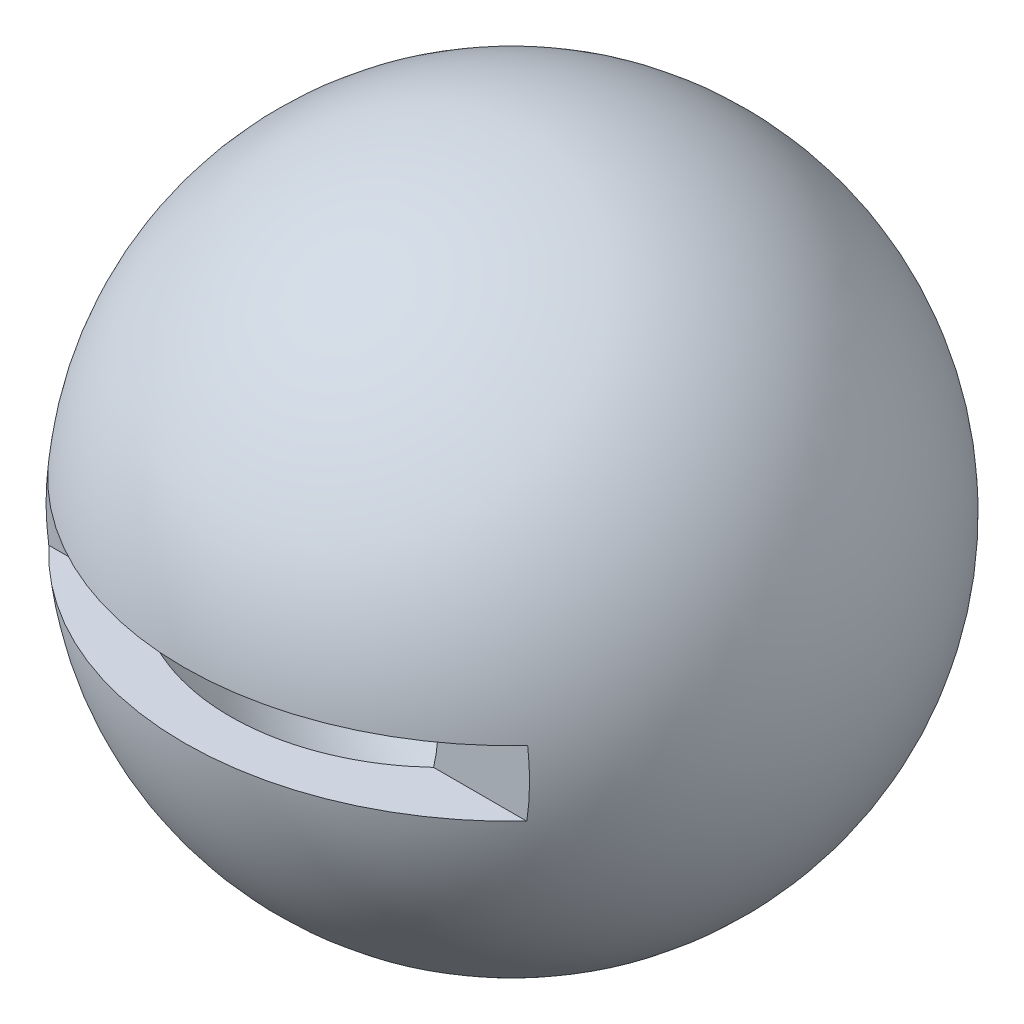
ISO-10303-21;
HEADER;
FILE_DESCRIPTION(('STEP AP214'),'2;1');
FILE_NAME('part.step','',(''),(''),'','','');
FILE_SCHEMA(('AUTOMOTIVE_DESIGN { 1 0 10303 214 1 1 1 1 }'));
ENDSEC;
DATA;
#1=APPLICATION_CONTEXT('core data for automotive mechanical design processes');
#2=APPLICATION_PROTOCOL_DEFINITION('international standard','automotive_design',2000,#1);
#3=PRODUCT_CONTEXT('',#1,'mechanical');
#4=PRODUCT('Part','Part','',(#3));
#5=PRODUCT_RELATED_PRODUCT_CATEGORY('part','',(#4));
#6=PRODUCT_DEFINITION_FORMATION('','',#4);
#7=PRODUCT_DEFINITION_CONTEXT('part definition',#1,'design');
#8=PRODUCT_DEFINITION('design','',#6,#7);
#9=PRODUCT_DEFINITION_SHAPE('','',#8);
#10=(LENGTH_UNIT() NAMED_UNIT(*) SI_UNIT(.MILLI.,.METRE.));
#11=(NAMED_UNIT(*) PLANE_ANGLE_UNIT() SI_UNIT($,.RADIAN.));
#12=(NAMED_UNIT(*) SI_UNIT($,.STERADIAN.) SOLID_ANGLE_UNIT());
#13=UNCERTAINTY_MEASURE_WITH_UNIT(LENGTH_MEASURE(1.E-05),#10,'distance_accuracy_value','');
#14=(GEOMETRIC_REPRESENTATION_CONTEXT(3) GLOBAL_UNCERTAINTY_ASSIGNED_CONTEXT((#13)) GLOBAL_UNIT_ASSIGNED_CONTEXT((#10,
#11,#12)) REPRESENTATION_CONTEXT('',''));
#15=CARTESIAN_POINT('',(0.,0.,0.));
#16=DIRECTION('',(0.,0.,1.));
#17=DIRECTION('',(1.,0.,0.));
#18=AXIS2_PLACEMENT_3D('',#15,#16,#17);
#19=CARTESIAN_POINT('',(0.,-25.,5.17896436009276));
#20=DIRECTION('',(0.,0.,-1.));
#21=DIRECTION('',(-1.,0.,0.));
#22=AXIS2_PLACEMENT_3D('',#19,#20,#21);
#23=SPHERICAL_SURFACE('',#22,16.4137503728601);
#24=CARTESIAN_POINT('',(0.,-25.,17.));
#25=DIRECTION('',(0.,0.,1.));
#26=DIRECTION('',(1.,0.,0.));
#27=AXIS2_PLACEMENT_3D('',#24,#25,#26);
#28=CIRCLE('',#27,11.3874631811746);
#29=CARTESIAN_POINT('',(-11.0521888117854,-27.7428890191278,17.));
#30=VERTEX_POINT('',#29);
#31=CARTESIAN_POINT('',(-11.1615307069699,-22.7428890191278,17.));
#32=VERTEX_POINT('',#31);
#33=EDGE_CURVE('E11',#30,#32,#28,.F.);
#34=ORIENTED_EDGE('',*,*,#33,.F.);
#35=CARTESIAN_POINT('',(0.,-27.7428890191278,5.17896436009276));
#36=DIRECTION('',(0.,-1.,0.));
#37=DIRECTION('',(0.,0.,-1.));
#38=AXIS2_PLACEMENT_3D('',#35,#36,#37);
#39=CIRCLE('',#38,16.1829466146098);
#40=CARTESIAN_POINT('',(11.0521888117854,-27.7428890191278,17.));
#41=VERTEX_POINT('',#40);
#42=EDGE_CURVE('E99',#30,#41,#39,.F.);
#43=ORIENTED_EDGE('',*,*,#42,.T.);
#44=CARTESIAN_POINT('',(11.1615307069699,-22.7428890191278,17.));
#45=VERTEX_POINT('',#44);
#46=EDGE_CURVE('E51',#45,#41,#28,.F.);
#47=ORIENTED_EDGE('',*,*,#46,.F.);
#48=CARTESIAN_POINT('',(0.,-22.7428890191278,5.17896436009276));
#49=DIRECTION('',(0.,1.,0.));
#50=DIRECTION('',(0.,0.,1.));
#51=AXIS2_PLACEMENT_3D('',#48,#49,#50);
#52=CIRCLE('',#51,16.2578181599681);
#53=EDGE_CURVE('E45',#45,#32,#52,.F.);
#54=ORIENTED_EDGE('',*,*,#53,.T.);
#55=EDGE_LOOP('',(#34,#43,#47,#54));
#56=FACE_BOUND('',#55,.T.);
#57=ADVANCED_FACE('F41',(#56),#23,.F.);
#58=CARTESIAN_POINT('',(-25.3252134033224,-22.7428890191278,17.));
#59=DIRECTION('',(0.,1.,0.));
#60=DIRECTION('',(0.,0.,1.));
#61=AXIS2_PLACEMENT_3D('',#58,#59,#60);
#62=PLANE('',#61);
#63=DIRECTION('',(-1.,0.,0.));
#64=VECTOR('',#63,1.);
#65=CARTESIAN_POINT('',(-25.3252134033224,-22.7428890191278,17.));
#66=LINE('',#65,#64);
#67=CARTESIAN_POINT('',(-18.1908067446176,-22.7428890191278,17.));
#68=VERTEX_POINT('',#67);
#69=EDGE_CURVE('E94',#32,#68,#66,.T.);
#70=ORIENTED_EDGE('',*,*,#69,.F.);
#71=ORIENTED_EDGE('',*,*,#53,.F.);
#72=CARTESIAN_POINT('',(18.1908067446176,-22.7428890191278,17.));
#73=VERTEX_POINT('',#72);
#74=EDGE_CURVE('E63',#73,#45,#66,.T.);
#75=ORIENTED_EDGE('',*,*,#74,.F.);
#76=CARTESIAN_POINT('',(0.,-22.7428890191278,0.));
#77=DIRECTION('',(0.,1.,0.));
#78=DIRECTION('',(0.,0.,1.));
#79=AXIS2_PLACEMENT_3D('',#76,#77,#78);
#80=CIRCLE('',#79,24.8979005143009);
#81=EDGE_CURVE('E90',#68,#73,#80,.T.);
#82=ORIENTED_EDGE('',*,*,#81,.F.);
#83=EDGE_LOOP('',(#70,#71,#75,#82));
#84=FACE_BOUND('',#83,.T.);
#85=ADVANCED_FACE('F89',(#84),#62,.F.);
#86=CARTESIAN_POINT('',(-25.3252134033224,-27.7428890191278,17.));
#87=DIRECTION('',(0.,-1.,0.));
#88=DIRECTION('',(0.,0.,-1.));
#89=AXIS2_PLACEMENT_3D('',#86,#87,#88);
#90=PLANE('',#89);
#91=DIRECTION('',(1.,0.,0.));
#92=VECTOR('',#91,1.);
#93=CARTESIAN_POINT('',(-25.3252134033224,-27.7428890191278,17.));
#94=LINE('',#93,#92);
#95=CARTESIAN_POINT('',(18.1239223080642,-27.7428890191278,17.));
#96=VERTEX_POINT('',#95);
#97=EDGE_CURVE('E58',#41,#96,#94,.T.);
#98=ORIENTED_EDGE('',*,*,#97,.F.);
#99=ORIENTED_EDGE('',*,*,#42,.F.);
#100=CARTESIAN_POINT('',(-18.1239223080642,-27.7428890191278,17.));
#101=VERTEX_POINT('',#100);
#102=EDGE_CURVE('E108',#101,#30,#94,.T.);
#103=ORIENTED_EDGE('',*,*,#102,.F.);
#104=CARTESIAN_POINT('',(0.,-27.7428890191278,0.));
#105=DIRECTION('',(0.,-1.,0.));
#106=DIRECTION('',(0.,0.,-1.));
#107=AXIS2_PLACEMENT_3D('',#104,#105,#106);
#108=CIRCLE('',#107,24.8490756332856);
#109=EDGE_CURVE('E97',#96,#101,#108,.T.);
#110=ORIENTED_EDGE('',*,*,#109,.F.);
#111=EDGE_LOOP('',(#98,#99,#103,#110));
#112=FACE_BOUND('',#111,.T.);
#113=ADVANCED_FACE('F105',(#112),#90,.F.);
#114=CARTESIAN_POINT('',(0.,0.,17.));
#115=DIRECTION('',(0.,0.,1.));
#116=DIRECTION('',(1.,0.,0.));
#117=AXIS2_PLACEMENT_3D('',#114,#115,#116);
#118=PLANE('',#117);
#119=CARTESIAN_POINT('',(0.,-25.,17.));
#120=DIRECTION('',(0.,0.,1.));
#121=DIRECTION('',(1.,0.,0.));
#122=AXIS2_PLACEMENT_3D('',#119,#120,#121);
#123=CIRCLE('',#122,18.3303027798234);
#124=EDGE_CURVE('E85',#68,#101,#123,.T.);
#125=ORIENTED_EDGE('',*,*,#124,.T.);
#126=ORIENTED_EDGE('',*,*,#102,.T.);
#127=ORIENTED_EDGE('',*,*,#33,.T.);
#128=ORIENTED_EDGE('',*,*,#69,.T.);
#129=EDGE_LOOP('',(#125,#126,#127,#128));
#130=FACE_BOUND('',#129,.T.);
#131=ADVANCED_FACE('F111',(#130),#118,.T.);
#132=EDGE_CURVE('E80',#96,#73,#123,.T.);
#133=ORIENTED_EDGE('',*,*,#132,.T.);
#134=ORIENTED_EDGE('',*,*,#74,.T.);
#135=ORIENTED_EDGE('',*,*,#46,.T.);
#136=ORIENTED_EDGE('',*,*,#97,.T.);
#137=EDGE_LOOP('',(#133,#134,#135,#136));
#138=FACE_BOUND('',#137,.T.);
#139=ADVANCED_FACE('F81',(#138),#118,.T.);
#140=CARTESIAN_POINT('',(0.,-25.,0.));
#141=DIRECTION('',(0.,1.,0.));
#142=DIRECTION('',(1.,0.,0.));
#143=AXIS2_PLACEMENT_3D('',#140,#141,#142);
#144=SPHERICAL_SURFACE('',#143,25.);
#145=ORIENTED_EDGE('',*,*,#124,.F.);
#146=ORIENTED_EDGE('',*,*,#81,.T.);
#147=ORIENTED_EDGE('',*,*,#132,.F.);
#148=ORIENTED_EDGE('',*,*,#109,.T.);
#149=EDGE_LOOP('',(#145,#146,#147,#148));
#150=FACE_BOUND('',#149,.T.);
#151=ADVANCED_FACE('F43',(#150),#144,.T.);
#152=CLOSED_SHELL('',(#57,#85,#113,#131,#139,#151));
#153=MANIFOLD_SOLID_BREP('B2',#152);
#154=ADVANCED_BREP_SHAPE_REPRESENTATION('',(#18,#153),#14);
#155=SHAPE_DEFINITION_REPRESENTATION(#9,#154);
ENDSEC;
END-ISO-10303-21;
